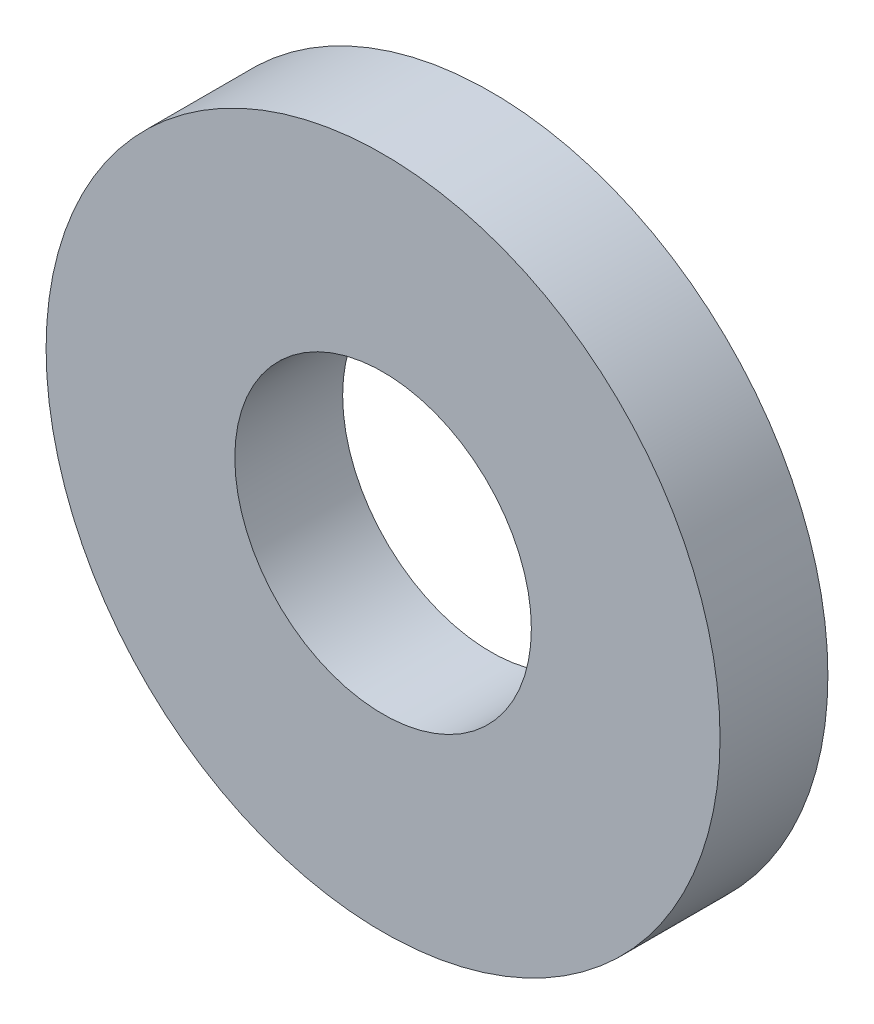
ISO-10303-21;
HEADER;
FILE_DESCRIPTION(('STEP AP214'),'2;1');
FILE_NAME('part.step','',(''),(''),'','','');
FILE_SCHEMA(('AUTOMOTIVE_DESIGN { 1 0 10303 214 1 1 1 1 }'));
ENDSEC;
DATA;
#1=APPLICATION_CONTEXT('core data for automotive mechanical design processes');
#2=APPLICATION_PROTOCOL_DEFINITION('international standard','automotive_design',2000,#1);
#3=PRODUCT_CONTEXT('',#1,'mechanical');
#4=PRODUCT('Part','Part','',(#3));
#5=PRODUCT_RELATED_PRODUCT_CATEGORY('part','',(#4));
#6=PRODUCT_DEFINITION_FORMATION('','',#4);
#7=PRODUCT_DEFINITION_CONTEXT('part definition',#1,'design');
#8=PRODUCT_DEFINITION('design','',#6,#7);
#9=PRODUCT_DEFINITION_SHAPE('','',#8);
#10=(LENGTH_UNIT() NAMED_UNIT(*) SI_UNIT(.MILLI.,.METRE.));
#11=(NAMED_UNIT(*) PLANE_ANGLE_UNIT() SI_UNIT($,.RADIAN.));
#12=(NAMED_UNIT(*) SI_UNIT($,.STERADIAN.) SOLID_ANGLE_UNIT());
#13=UNCERTAINTY_MEASURE_WITH_UNIT(LENGTH_MEASURE(1.E-05),#10,'distance_accuracy_value','');
#14=(GEOMETRIC_REPRESENTATION_CONTEXT(3) GLOBAL_UNCERTAINTY_ASSIGNED_CONTEXT((#13)) GLOBAL_UNIT_ASSIGNED_CONTEXT((#10,
#11,#12)) REPRESENTATION_CONTEXT('',''));
#15=CARTESIAN_POINT('',(0.,0.,0.));
#16=DIRECTION('',(0.,0.,1.));
#17=DIRECTION('',(1.,0.,0.));
#18=AXIS2_PLACEMENT_3D('',#15,#16,#17);
#19=CARTESIAN_POINT('',(0.,0.,-0.8));
#20=DIRECTION('',(0.,0.,1.));
#21=DIRECTION('',(1.,0.,0.));
#22=AXIS2_PLACEMENT_3D('',#19,#20,#21);
#23=CYLINDRICAL_SURFACE('',#22,2.5);
#24=CARTESIAN_POINT('',(0.,0.,-0.8));
#25=DIRECTION('',(0.,0.,1.));
#26=DIRECTION('',(1.,0.,0.));
#27=AXIS2_PLACEMENT_3D('',#24,#25,#26);
#28=CIRCLE('',#27,2.5);
#29=CARTESIAN_POINT('',(2.5,0.,-0.8));
#30=VERTEX_POINT('',#29);
#31=EDGE_CURVE('E10',#30,#30,#28,.T.);
#32=ORIENTED_EDGE('',*,*,#31,.T.);
#33=EDGE_LOOP('',(#32));
#34=FACE_BOUND('',#33,.T.);
#35=CARTESIAN_POINT('',(0.,0.,0.));
#36=DIRECTION('',(0.,0.,1.));
#37=DIRECTION('',(1.,0.,0.));
#38=AXIS2_PLACEMENT_3D('',#35,#36,#37);
#39=CIRCLE('',#38,2.5);
#40=CARTESIAN_POINT('',(2.5,0.,0.));
#41=VERTEX_POINT('',#40);
#42=EDGE_CURVE('E37',#41,#41,#39,.T.);
#43=ORIENTED_EDGE('',*,*,#42,.F.);
#44=EDGE_LOOP('',(#43));
#45=FACE_BOUND('',#44,.T.);
#46=ADVANCED_FACE('F34',(#34,#45),#23,.T.);
#47=CARTESIAN_POINT('',(0.,0.,-0.8));
#48=DIRECTION('',(0.,0.,1.));
#49=DIRECTION('',(1.,0.,0.));
#50=AXIS2_PLACEMENT_3D('',#47,#48,#49);
#51=PLANE('',#50);
#52=CARTESIAN_POINT('',(0.,0.,-0.8));
#53=DIRECTION('',(0.,0.,1.));
#54=DIRECTION('',(1.,0.,0.));
#55=AXIS2_PLACEMENT_3D('',#52,#53,#54);
#56=CIRCLE('',#55,1.1);
#57=CARTESIAN_POINT('',(1.1,0.,-0.8));
#58=VERTEX_POINT('',#57);
#59=EDGE_CURVE('E44',#58,#58,#56,.T.);
#60=ORIENTED_EDGE('',*,*,#59,.T.);
#61=EDGE_LOOP('',(#60));
#62=FACE_BOUND('',#61,.T.);
#63=ORIENTED_EDGE('',*,*,#31,.F.);
#64=EDGE_LOOP('',(#63));
#65=FACE_BOUND('',#64,.T.);
#66=ADVANCED_FACE('F52',(#62,#65),#51,.F.);
#67=CARTESIAN_POINT('',(0.,0.,0.));
#68=DIRECTION('',(0.,0.,1.));
#69=DIRECTION('',(1.,0.,0.));
#70=AXIS2_PLACEMENT_3D('',#67,#68,#69);
#71=PLANE('',#70);
#72=CARTESIAN_POINT('',(0.,0.,0.));
#73=DIRECTION('',(0.,0.,1.));
#74=DIRECTION('',(1.,0.,0.));
#75=AXIS2_PLACEMENT_3D('',#72,#73,#74);
#76=CIRCLE('',#75,1.1);
#77=CARTESIAN_POINT('',(1.1,0.,0.));
#78=VERTEX_POINT('',#77);
#79=EDGE_CURVE('E46',#78,#78,#76,.T.);
#80=ORIENTED_EDGE('',*,*,#79,.F.);
#81=EDGE_LOOP('',(#80));
#82=FACE_BOUND('',#81,.T.);
#83=ORIENTED_EDGE('',*,*,#42,.T.);
#84=EDGE_LOOP('',(#83));
#85=FACE_BOUND('',#84,.T.);
#86=ADVANCED_FACE('F58',(#82,#85),#71,.T.);
#87=CARTESIAN_POINT('',(0.,0.,-0.8));
#88=DIRECTION('',(0.,0.,1.));
#89=DIRECTION('',(1.,0.,0.));
#90=AXIS2_PLACEMENT_3D('',#87,#88,#89);
#91=CYLINDRICAL_SURFACE('',#90,1.1);
#92=ORIENTED_EDGE('',*,*,#59,.F.);
#93=EDGE_LOOP('',(#92));
#94=FACE_BOUND('',#93,.T.);
#95=ORIENTED_EDGE('',*,*,#79,.T.);
#96=EDGE_LOOP('',(#95));
#97=FACE_BOUND('',#96,.T.);
#98=ADVANCED_FACE('F55',(#94,#97),#91,.F.);
#99=CLOSED_SHELL('',(#46,#66,#86,#98));
#100=MANIFOLD_SOLID_BREP('B2',#99);
#101=ADVANCED_BREP_SHAPE_REPRESENTATION('',(#18,#100),#14);
#102=SHAPE_DEFINITION_REPRESENTATION(#9,#101);
ENDSEC;
END-ISO-10303-21;
